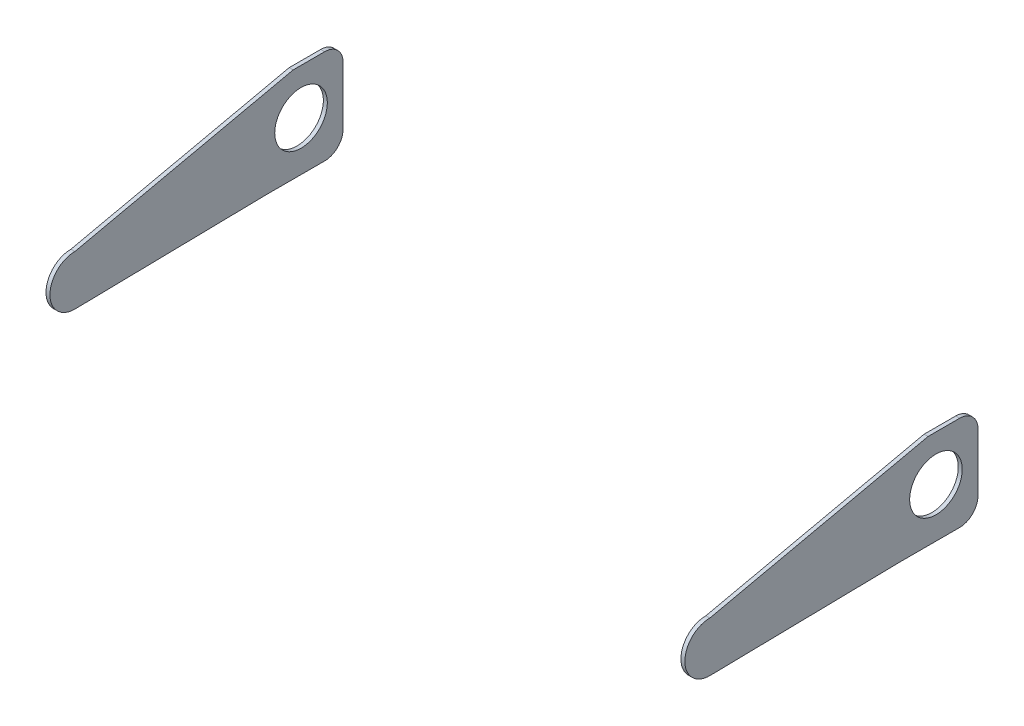
ISO-10303-21;
HEADER;
FILE_DESCRIPTION(('STEP AP214'),'2;1');
FILE_NAME('part.step','',(''),(''),'','','');
FILE_SCHEMA(('AUTOMOTIVE_DESIGN { 1 0 10303 214 1 1 1 1 }'));
ENDSEC;
DATA;
#1=APPLICATION_CONTEXT('core data for automotive mechanical design processes');
#2=APPLICATION_PROTOCOL_DEFINITION('international standard','automotive_design',2000,#1);
#3=PRODUCT_CONTEXT('',#1,'mechanical');
#4=PRODUCT('Part','Part','',(#3));
#5=PRODUCT_RELATED_PRODUCT_CATEGORY('part','',(#4));
#6=PRODUCT_DEFINITION_FORMATION('','',#4);
#7=PRODUCT_DEFINITION_CONTEXT('part definition',#1,'design');
#8=PRODUCT_DEFINITION('design','',#6,#7);
#9=PRODUCT_DEFINITION_SHAPE('','',#8);
#10=(LENGTH_UNIT() NAMED_UNIT(*) SI_UNIT(.MILLI.,.METRE.));
#11=(NAMED_UNIT(*) PLANE_ANGLE_UNIT() SI_UNIT($,.RADIAN.));
#12=(NAMED_UNIT(*) SI_UNIT($,.STERADIAN.) SOLID_ANGLE_UNIT());
#13=UNCERTAINTY_MEASURE_WITH_UNIT(LENGTH_MEASURE(1.E-05),#10,'distance_accuracy_value','');
#14=(GEOMETRIC_REPRESENTATION_CONTEXT(3) GLOBAL_UNCERTAINTY_ASSIGNED_CONTEXT((#13)) GLOBAL_UNIT_ASSIGNED_CONTEXT((#10,
#11,#12)) REPRESENTATION_CONTEXT('',''));
#15=CARTESIAN_POINT('',(0.,0.,0.));
#16=DIRECTION('',(0.,0.,1.));
#17=DIRECTION('',(1.,0.,0.));
#18=AXIS2_PLACEMENT_3D('',#15,#16,#17);
#19=CARTESIAN_POINT('',(121.5,10.3,-84.));
#20=DIRECTION('',(1.,0.,0.));
#21=DIRECTION('',(0.,0.,1.));
#22=AXIS2_PLACEMENT_3D('',#19,#20,#21);
#23=PLANE('',#22);
#24=DIRECTION('',(0.,0.,-1.));
#25=VECTOR('',#24,1.);
#26=CARTESIAN_POINT('',(121.5,17.3,-72.));
#27=LINE('',#26,#25);
#28=CARTESIAN_POINT('',(121.5,17.3,-72.));
#29=VERTEX_POINT('',#28);
#30=CARTESIAN_POINT('',(121.5,17.3,-84.));
#31=VERTEX_POINT('',#30);
#32=EDGE_CURVE('E166',#29,#31,#27,.T.);
#33=ORIENTED_EDGE('',*,*,#32,.F.);
#34=DIRECTION('',(0.,0.215310657716966,-0.976545606038698));
#35=VECTOR('',#34,1.);
#36=CARTESIAN_POINT('',(121.5,17.3,-72.));
#37=LINE('',#36,#35);
#38=CARTESIAN_POINT('',(121.5,-1.,11.));
#39=VERTEX_POINT('',#38);
#40=EDGE_CURVE('E141',#39,#29,#37,.T.);
#41=ORIENTED_EDGE('',*,*,#40,.F.);
#42=CARTESIAN_POINT('',(121.5,-10.5,11.));
#43=DIRECTION('',(-1.,0.,0.));
#44=DIRECTION('',(0.,0.,1.));
#45=AXIS2_PLACEMENT_3D('',#42,#43,#44);
#46=CIRCLE('',#45,9.5);
#47=CARTESIAN_POINT('',(121.5,-20.,11.));
#48=VERTEX_POINT('',#47);
#49=EDGE_CURVE('E123',#48,#39,#46,.T.);
#50=ORIENTED_EDGE('',*,*,#49,.F.);
#51=DIRECTION('',(0.,-0.0178403028537357,0.999840849132544));
#52=VECTOR('',#51,1.);
#53=CARTESIAN_POINT('',(121.5,-20.,11.));
#54=LINE('',#53,#52);
#55=CARTESIAN_POINT('',(121.5,-18.7,-61.8571210101487));
#56=VERTEX_POINT('',#55);
#57=EDGE_CURVE('E134',#56,#48,#54,.T.);
#58=ORIENTED_EDGE('',*,*,#57,.F.);
#59=DIRECTION('',(0.,0.,1.));
#60=VECTOR('',#59,1.);
#61=CARTESIAN_POINT('',(121.5,-18.7,-61.8571210101487));
#62=LINE('',#61,#60);
#63=CARTESIAN_POINT('',(121.5,-18.7,-84.));
#64=VERTEX_POINT('',#63);
#65=EDGE_CURVE('E138',#64,#56,#62,.T.);
#66=ORIENTED_EDGE('',*,*,#65,.F.);
#67=CARTESIAN_POINT('',(121.5,-11.7,-84.));
#68=DIRECTION('',(-1.,0.,0.));
#69=DIRECTION('',(0.,0.,-1.));
#70=AXIS2_PLACEMENT_3D('',#67,#68,#69);
#71=CIRCLE('',#70,7.);
#72=CARTESIAN_POINT('',(121.5,-11.7,-91.));
#73=VERTEX_POINT('',#72);
#74=EDGE_CURVE('E192',#73,#64,#71,.T.);
#75=ORIENTED_EDGE('',*,*,#74,.F.);
#76=DIRECTION('',(0.,-1.,0.));
#77=VECTOR('',#76,1.);
#78=CARTESIAN_POINT('',(121.5,-11.7,-91.));
#79=LINE('',#78,#77);
#80=CARTESIAN_POINT('',(121.5,10.3,-91.));
#81=VERTEX_POINT('',#80);
#82=EDGE_CURVE('E188',#81,#73,#79,.T.);
#83=ORIENTED_EDGE('',*,*,#82,.F.);
#84=CARTESIAN_POINT('',(121.5,10.3,-84.));
#85=DIRECTION('',(-1.,0.,0.));
#86=DIRECTION('',(0.,0.,1.));
#87=AXIS2_PLACEMENT_3D('',#84,#85,#86);
#88=CIRCLE('',#87,7.);
#89=EDGE_CURVE('E180',#31,#81,#88,.T.);
#90=ORIENTED_EDGE('',*,*,#89,.F.);
#91=EDGE_LOOP('',(#33,#41,#50,#58,#66,#75,#83,#90));
#92=FACE_BOUND('',#91,.T.);
#93=CARTESIAN_POINT('',(121.5,0.,-75.));
#94=DIRECTION('',(-1.,0.,0.));
#95=DIRECTION('',(0.,0.,1.));
#96=AXIS2_PLACEMENT_3D('',#93,#94,#95);
#97=CIRCLE('',#96,9.99999999999999);
#98=CARTESIAN_POINT('',(121.5,0.,-65.));
#99=VERTEX_POINT('',#98);
#100=EDGE_CURVE('E155',#99,#99,#97,.T.);
#101=ORIENTED_EDGE('',*,*,#100,.T.);
#102=EDGE_LOOP('',(#101));
#103=FACE_BOUND('',#102,.T.);
#104=ADVANCED_FACE('F51',(#92,#103),#23,.T.);
#105=CARTESIAN_POINT('',(120.,10.3,-84.));
#106=DIRECTION('',(1.,0.,0.));
#107=DIRECTION('',(0.,0.,1.));
#108=AXIS2_PLACEMENT_3D('',#105,#106,#107);
#109=PLANE('',#108);
#110=DIRECTION('',(0.,0.,-1.));
#111=VECTOR('',#110,1.);
#112=CARTESIAN_POINT('',(120.,17.3,-72.));
#113=LINE('',#112,#111);
#114=CARTESIAN_POINT('',(120.,17.3,-72.));
#115=VERTEX_POINT('',#114);
#116=CARTESIAN_POINT('',(120.,17.3,-84.));
#117=VERTEX_POINT('',#116);
#118=EDGE_CURVE('E146',#115,#117,#113,.T.);
#119=ORIENTED_EDGE('',*,*,#118,.T.);
#120=CARTESIAN_POINT('',(120.,10.3,-84.));
#121=DIRECTION('',(-1.,0.,0.));
#122=DIRECTION('',(0.,0.,1.));
#123=AXIS2_PLACEMENT_3D('',#120,#121,#122);
#124=CIRCLE('',#123,7.);
#125=CARTESIAN_POINT('',(120.,10.3,-91.));
#126=VERTEX_POINT('',#125);
#127=EDGE_CURVE('E151',#117,#126,#124,.T.);
#128=ORIENTED_EDGE('',*,*,#127,.T.);
#129=DIRECTION('',(0.,-1.,0.));
#130=VECTOR('',#129,1.);
#131=CARTESIAN_POINT('',(120.,-11.7,-91.));
#132=LINE('',#131,#130);
#133=CARTESIAN_POINT('',(120.,-11.7,-91.));
#134=VERTEX_POINT('',#133);
#135=EDGE_CURVE('E154',#126,#134,#132,.T.);
#136=ORIENTED_EDGE('',*,*,#135,.T.);
#137=CARTESIAN_POINT('',(120.,-11.7,-84.));
#138=DIRECTION('',(-1.,0.,0.));
#139=DIRECTION('',(0.,0.,-1.));
#140=AXIS2_PLACEMENT_3D('',#137,#138,#139);
#141=CIRCLE('',#140,7.);
#142=CARTESIAN_POINT('',(120.,-18.7,-84.));
#143=VERTEX_POINT('',#142);
#144=EDGE_CURVE('E158',#134,#143,#141,.T.);
#145=ORIENTED_EDGE('',*,*,#144,.T.);
#146=DIRECTION('',(0.,0.,1.));
#147=VECTOR('',#146,1.);
#148=CARTESIAN_POINT('',(120.,-18.7,-61.8571210101487));
#149=LINE('',#148,#147);
#150=CARTESIAN_POINT('',(120.,-18.7,-61.8571210101487));
#151=VERTEX_POINT('',#150);
#152=EDGE_CURVE('E161',#143,#151,#149,.T.);
#153=ORIENTED_EDGE('',*,*,#152,.T.);
#154=DIRECTION('',(0.,-0.0178403028537357,0.999840849132544));
#155=VECTOR('',#154,1.);
#156=CARTESIAN_POINT('',(120.,-20.,11.));
#157=LINE('',#156,#155);
#158=CARTESIAN_POINT('',(120.,-20.,11.));
#159=VERTEX_POINT('',#158);
#160=EDGE_CURVE('E163',#151,#159,#157,.T.);
#161=ORIENTED_EDGE('',*,*,#160,.T.);
#162=CARTESIAN_POINT('',(120.,-10.5,11.));
#163=DIRECTION('',(-1.,0.,0.));
#164=DIRECTION('',(0.,0.,1.));
#165=AXIS2_PLACEMENT_3D('',#162,#163,#164);
#166=CIRCLE('',#165,9.5);
#167=CARTESIAN_POINT('',(120.,-1.,11.));
#168=VERTEX_POINT('',#167);
#169=EDGE_CURVE('E130',#159,#168,#166,.T.);
#170=ORIENTED_EDGE('',*,*,#169,.T.);
#171=DIRECTION('',(0.,0.215310657716966,-0.976545606038698));
#172=VECTOR('',#171,1.);
#173=CARTESIAN_POINT('',(120.,17.3,-72.));
#174=LINE('',#173,#172);
#175=EDGE_CURVE('E170',#168,#115,#174,.T.);
#176=ORIENTED_EDGE('',*,*,#175,.T.);
#177=EDGE_LOOP('',(#119,#128,#136,#145,#153,#161,#170,#176));
#178=FACE_BOUND('',#177,.T.);
#179=CARTESIAN_POINT('',(120.,0.,-75.));
#180=DIRECTION('',(-1.,0.,0.));
#181=DIRECTION('',(0.,0.,1.));
#182=AXIS2_PLACEMENT_3D('',#179,#180,#181);
#183=CIRCLE('',#182,9.99999999999999);
#184=CARTESIAN_POINT('',(120.,0.,-65.));
#185=VERTEX_POINT('',#184);
#186=EDGE_CURVE('E194',#185,#185,#183,.T.);
#187=ORIENTED_EDGE('',*,*,#186,.F.);
#188=EDGE_LOOP('',(#187));
#189=FACE_BOUND('',#188,.T.);
#190=ADVANCED_FACE('F183',(#178,#189),#109,.F.);
#191=CARTESIAN_POINT('',(121.5,17.3,-72.));
#192=DIRECTION('',(0.,-1.,0.));
#193=DIRECTION('',(0.,0.,-1.));
#194=AXIS2_PLACEMENT_3D('',#191,#192,#193);
#195=PLANE('',#194);
#196=ORIENTED_EDGE('',*,*,#118,.F.);
#197=DIRECTION('',(-1.,0.,0.));
#198=VECTOR('',#197,1.);
#199=CARTESIAN_POINT('',(121.5,17.3,-72.));
#200=LINE('',#199,#198);
#201=EDGE_CURVE('E70',#29,#115,#200,.T.);
#202=ORIENTED_EDGE('',*,*,#201,.F.);
#203=ORIENTED_EDGE('',*,*,#32,.T.);
#204=DIRECTION('',(-1.,0.,0.));
#205=VECTOR('',#204,1.);
#206=CARTESIAN_POINT('',(121.5,17.3,-84.));
#207=LINE('',#206,#205);
#208=EDGE_CURVE('E12',#31,#117,#207,.T.);
#209=ORIENTED_EDGE('',*,*,#208,.T.);
#210=EDGE_LOOP('',(#196,#202,#203,#209));
#211=FACE_BOUND('',#210,.T.);
#212=ADVANCED_FACE('F52',(#211),#195,.F.);
#213=CARTESIAN_POINT('',(121.5,10.3,-84.));
#214=DIRECTION('',(-1.,0.,0.));
#215=DIRECTION('',(0.,0.,-1.));
#216=AXIS2_PLACEMENT_3D('',#213,#214,#215);
#217=CYLINDRICAL_SURFACE('',#216,7.);
#218=ORIENTED_EDGE('',*,*,#127,.F.);
#219=ORIENTED_EDGE('',*,*,#208,.F.);
#220=ORIENTED_EDGE('',*,*,#89,.T.);
#221=DIRECTION('',(-1.,0.,0.));
#222=VECTOR('',#221,1.);
#223=CARTESIAN_POINT('',(121.5,10.3,-91.));
#224=LINE('',#223,#222);
#225=EDGE_CURVE('E58',#81,#126,#224,.T.);
#226=ORIENTED_EDGE('',*,*,#225,.T.);
#227=EDGE_LOOP('',(#218,#219,#220,#226));
#228=FACE_BOUND('',#227,.T.);
#229=ADVANCED_FACE('F176',(#228),#217,.T.);
#230=CARTESIAN_POINT('',(121.5,-11.7,-91.));
#231=DIRECTION('',(0.,0.,1.));
#232=DIRECTION('',(-1.,0.,0.));
#233=AXIS2_PLACEMENT_3D('',#230,#231,#232);
#234=PLANE('',#233);
#235=ORIENTED_EDGE('',*,*,#135,.F.);
#236=ORIENTED_EDGE('',*,*,#225,.F.);
#237=ORIENTED_EDGE('',*,*,#82,.T.);
#238=DIRECTION('',(-1.,0.,0.));
#239=VECTOR('',#238,1.);
#240=CARTESIAN_POINT('',(121.5,-11.7,-91.));
#241=LINE('',#240,#239);
#242=EDGE_CURVE('E171',#73,#134,#241,.T.);
#243=ORIENTED_EDGE('',*,*,#242,.T.);
#244=EDGE_LOOP('',(#235,#236,#237,#243));
#245=FACE_BOUND('',#244,.T.);
#246=ADVANCED_FACE('F185',(#245),#234,.F.);
#247=CARTESIAN_POINT('',(121.5,-11.7,-84.));
#248=DIRECTION('',(-1.,0.,0.));
#249=DIRECTION('',(0.,0.,-1.));
#250=AXIS2_PLACEMENT_3D('',#247,#248,#249);
#251=CYLINDRICAL_SURFACE('',#250,7.);
#252=ORIENTED_EDGE('',*,*,#144,.F.);
#253=ORIENTED_EDGE('',*,*,#242,.F.);
#254=ORIENTED_EDGE('',*,*,#74,.T.);
#255=DIRECTION('',(-1.,0.,0.));
#256=VECTOR('',#255,1.);
#257=CARTESIAN_POINT('',(121.5,-18.7,-84.));
#258=LINE('',#257,#256);
#259=EDGE_CURVE('E173',#64,#143,#258,.T.);
#260=ORIENTED_EDGE('',*,*,#259,.T.);
#261=EDGE_LOOP('',(#252,#253,#254,#260));
#262=FACE_BOUND('',#261,.T.);
#263=ADVANCED_FACE('F205',(#262),#251,.T.);
#264=CARTESIAN_POINT('',(121.5,-18.7,-61.8571210101487));
#265=DIRECTION('',(0.,1.,0.));
#266=DIRECTION('',(0.,0.,1.));
#267=AXIS2_PLACEMENT_3D('',#264,#265,#266);
#268=PLANE('',#267);
#269=ORIENTED_EDGE('',*,*,#152,.F.);
#270=ORIENTED_EDGE('',*,*,#259,.F.);
#271=ORIENTED_EDGE('',*,*,#65,.T.);
#272=DIRECTION('',(-1.,0.,0.));
#273=VECTOR('',#272,1.);
#274=CARTESIAN_POINT('',(121.5,-18.7,-61.8571210101487));
#275=LINE('',#274,#273);
#276=EDGE_CURVE('E132',#56,#151,#275,.T.);
#277=ORIENTED_EDGE('',*,*,#276,.T.);
#278=EDGE_LOOP('',(#269,#270,#271,#277));
#279=FACE_BOUND('',#278,.T.);
#280=ADVANCED_FACE('F200',(#279),#268,.F.);
#281=CARTESIAN_POINT('',(121.5,-20.,11.));
#282=DIRECTION('',(0.,0.999840849132544,0.0178403028537357));
#283=DIRECTION('',(0.,-0.0178403028537357,0.999840849132544));
#284=AXIS2_PLACEMENT_3D('',#281,#282,#283);
#285=PLANE('',#284);
#286=ORIENTED_EDGE('',*,*,#160,.F.);
#287=ORIENTED_EDGE('',*,*,#276,.F.);
#288=ORIENTED_EDGE('',*,*,#57,.T.);
#289=DIRECTION('',(-1.,0.,0.));
#290=VECTOR('',#289,1.);
#291=CARTESIAN_POINT('',(121.5,-20.,11.));
#292=LINE('',#291,#290);
#293=EDGE_CURVE('E116',#48,#159,#292,.T.);
#294=ORIENTED_EDGE('',*,*,#293,.T.);
#295=EDGE_LOOP('',(#286,#287,#288,#294));
#296=FACE_BOUND('',#295,.T.);
#297=ADVANCED_FACE('F131',(#296),#285,.F.);
#298=CARTESIAN_POINT('',(121.5,-10.5,11.));
#299=DIRECTION('',(-1.,0.,0.));
#300=DIRECTION('',(0.,0.,-1.));
#301=AXIS2_PLACEMENT_3D('',#298,#299,#300);
#302=CYLINDRICAL_SURFACE('',#301,9.5);
#303=ORIENTED_EDGE('',*,*,#169,.F.);
#304=ORIENTED_EDGE('',*,*,#293,.F.);
#305=ORIENTED_EDGE('',*,*,#49,.T.);
#306=DIRECTION('',(-1.,0.,0.));
#307=VECTOR('',#306,1.);
#308=CARTESIAN_POINT('',(121.5,-1.,11.));
#309=LINE('',#308,#307);
#310=EDGE_CURVE('E96',#39,#168,#309,.T.);
#311=ORIENTED_EDGE('',*,*,#310,.T.);
#312=EDGE_LOOP('',(#303,#304,#305,#311));
#313=FACE_BOUND('',#312,.T.);
#314=ADVANCED_FACE('F121',(#313),#302,.T.);
#315=CARTESIAN_POINT('',(121.5,17.3,-72.));
#316=DIRECTION('',(0.,-0.976545606038698,-0.215310657716966));
#317=DIRECTION('',(0.,0.215310657716966,-0.976545606038698));
#318=AXIS2_PLACEMENT_3D('',#315,#316,#317);
#319=PLANE('',#318);
#320=ORIENTED_EDGE('',*,*,#175,.F.);
#321=ORIENTED_EDGE('',*,*,#310,.F.);
#322=ORIENTED_EDGE('',*,*,#40,.T.);
#323=ORIENTED_EDGE('',*,*,#201,.T.);
#324=EDGE_LOOP('',(#320,#321,#322,#323));
#325=FACE_BOUND('',#324,.T.);
#326=ADVANCED_FACE('F219',(#325),#319,.F.);
#327=CARTESIAN_POINT('',(121.5,0.,-75.));
#328=DIRECTION('',(-1.,0.,0.));
#329=DIRECTION('',(0.,0.,-1.));
#330=AXIS2_PLACEMENT_3D('',#327,#328,#329);
#331=CYLINDRICAL_SURFACE('',#330,9.99999999999999);
#332=ORIENTED_EDGE('',*,*,#100,.F.);
#333=EDGE_LOOP('',(#332));
#334=FACE_BOUND('',#333,.T.);
#335=ORIENTED_EDGE('',*,*,#186,.T.);
#336=EDGE_LOOP('',(#335));
#337=FACE_BOUND('',#336,.T.);
#338=ADVANCED_FACE('F217',(#334,#337),#331,.F.);
#339=CLOSED_SHELL('',(#104,#190,#212,#229,#246,#263,#280,#297,#314,#326,#338));
#340=MANIFOLD_SOLID_BREP('B2',#339);
#341=CARTESIAN_POINT('',(-121.5,10.3,-84.));
#342=DIRECTION('',(-1.,0.,0.));
#343=DIRECTION('',(0.,0.,1.));
#344=AXIS2_PLACEMENT_3D('',#341,#342,#343);
#345=PLANE('',#344);
#346=DIRECTION('',(0.,0.,-1.));
#347=VECTOR('',#346,1.);
#348=CARTESIAN_POINT('',(-121.5,17.3,-72.));
#349=LINE('',#348,#347);
#350=CARTESIAN_POINT('',(-121.5,17.3,-72.));
#351=VERTEX_POINT('',#350);
#352=CARTESIAN_POINT('',(-121.5,17.3,-84.));
#353=VERTEX_POINT('',#352);
#354=EDGE_CURVE('E411',#351,#353,#349,.T.);
#355=ORIENTED_EDGE('',*,*,#354,.T.);
#356=CARTESIAN_POINT('',(-121.5,10.3,-84.));
#357=DIRECTION('',(-1.,0.,0.));
#358=DIRECTION('',(0.,0.,1.));
#359=AXIS2_PLACEMENT_3D('',#356,#357,#358);
#360=CIRCLE('',#359,7.);
#361=CARTESIAN_POINT('',(-121.5,10.3,-91.));
#362=VERTEX_POINT('',#361);
#363=EDGE_CURVE('E357',#353,#362,#360,.T.);
#364=ORIENTED_EDGE('',*,*,#363,.T.);
#365=DIRECTION('',(0.,-1.,0.));
#366=VECTOR('',#365,1.);
#367=CARTESIAN_POINT('',(-121.5,-11.7,-91.));
#368=LINE('',#367,#366);
#369=CARTESIAN_POINT('',(-121.5,-11.7,-91.));
#370=VERTEX_POINT('',#369);
#371=EDGE_CURVE('E430',#362,#370,#368,.T.);
#372=ORIENTED_EDGE('',*,*,#371,.T.);
#373=CARTESIAN_POINT('',(-121.5,-11.7,-84.));
#374=DIRECTION('',(-1.,0.,0.));
#375=DIRECTION('',(0.,0.,-1.));
#376=AXIS2_PLACEMENT_3D('',#373,#374,#375);
#377=CIRCLE('',#376,7.);
#378=CARTESIAN_POINT('',(-121.5,-18.7,-84.));
#379=VERTEX_POINT('',#378);
#380=EDGE_CURVE('E439',#370,#379,#377,.T.);
#381=ORIENTED_EDGE('',*,*,#380,.T.);
#382=DIRECTION('',(0.,0.,1.));
#383=VECTOR('',#382,1.);
#384=CARTESIAN_POINT('',(-121.5,-18.7,-61.8571210101487));
#385=LINE('',#384,#383);
#386=CARTESIAN_POINT('',(-121.5,-18.7,-61.8571210101487));
#387=VERTEX_POINT('',#386);
#388=EDGE_CURVE('E377',#379,#387,#385,.T.);
#389=ORIENTED_EDGE('',*,*,#388,.T.);
#390=DIRECTION('',(0.,-0.0178403028537357,0.999840849132544));
#391=VECTOR('',#390,1.);
#392=CARTESIAN_POINT('',(-121.5,-20.,11.));
#393=LINE('',#392,#391);
#394=CARTESIAN_POINT('',(-121.5,-20.,11.));
#395=VERTEX_POINT('',#394);
#396=EDGE_CURVE('E373',#387,#395,#393,.T.);
#397=ORIENTED_EDGE('',*,*,#396,.T.);
#398=CARTESIAN_POINT('',(-121.5,-10.5,11.));
#399=DIRECTION('',(-1.,0.,0.));
#400=DIRECTION('',(0.,0.,1.));
#401=AXIS2_PLACEMENT_3D('',#398,#399,#400);
#402=CIRCLE('',#401,9.5);
#403=CARTESIAN_POINT('',(-121.5,-1.,11.));
#404=VERTEX_POINT('',#403);
#405=EDGE_CURVE('E380',#395,#404,#402,.T.);
#406=ORIENTED_EDGE('',*,*,#405,.T.);
#407=DIRECTION('',(0.,0.215310657716966,-0.976545606038698));
#408=VECTOR('',#407,1.);
#409=CARTESIAN_POINT('',(-121.5,17.3,-72.));
#410=LINE('',#409,#408);
#411=EDGE_CURVE('E320',#404,#351,#410,.T.);
#412=ORIENTED_EDGE('',*,*,#411,.T.);
#413=EDGE_LOOP('',(#355,#364,#372,#381,#389,#397,#406,#412));
#414=FACE_BOUND('',#413,.T.);
#415=CARTESIAN_POINT('',(-121.5,0.,-75.));
#416=DIRECTION('',(-1.,0.,0.));
#417=DIRECTION('',(0.,0.,1.));
#418=AXIS2_PLACEMENT_3D('',#415,#416,#417);
#419=CIRCLE('',#418,9.99999999999999);
#420=CARTESIAN_POINT('',(-121.5,0.,-65.));
#421=VERTEX_POINT('',#420);
#422=EDGE_CURVE('E402',#421,#421,#419,.T.);
#423=ORIENTED_EDGE('',*,*,#422,.F.);
#424=EDGE_LOOP('',(#423));
#425=FACE_BOUND('',#424,.T.);
#426=ADVANCED_FACE('F296',(#414,#425),#345,.T.);
#427=CARTESIAN_POINT('',(-120.,10.3,-84.));
#428=DIRECTION('',(-1.,0.,0.));
#429=DIRECTION('',(0.,0.,1.));
#430=AXIS2_PLACEMENT_3D('',#427,#428,#429);
#431=PLANE('',#430);
#432=DIRECTION('',(0.,0.,-1.));
#433=VECTOR('',#432,1.);
#434=CARTESIAN_POINT('',(-120.,17.3,-72.));
#435=LINE('',#434,#433);
#436=CARTESIAN_POINT('',(-120.,17.3,-72.));
#437=VERTEX_POINT('',#436);
#438=CARTESIAN_POINT('',(-120.,17.3,-84.));
#439=VERTEX_POINT('',#438);
#440=EDGE_CURVE('E396',#437,#439,#435,.T.);
#441=ORIENTED_EDGE('',*,*,#440,.F.);
#442=DIRECTION('',(0.,0.215310657716966,-0.976545606038698));
#443=VECTOR('',#442,1.);
#444=CARTESIAN_POINT('',(-120.,17.3,-72.));
#445=LINE('',#444,#443);
#446=CARTESIAN_POINT('',(-120.,-1.,11.));
#447=VERTEX_POINT('',#446);
#448=EDGE_CURVE('E355',#447,#437,#445,.T.);
#449=ORIENTED_EDGE('',*,*,#448,.F.);
#450=CARTESIAN_POINT('',(-120.,-10.5,11.));
#451=DIRECTION('',(-1.,0.,0.));
#452=DIRECTION('',(0.,0.,1.));
#453=AXIS2_PLACEMENT_3D('',#450,#451,#452);
#454=CIRCLE('',#453,9.5);
#455=CARTESIAN_POINT('',(-120.,-20.,11.));
#456=VERTEX_POINT('',#455);
#457=EDGE_CURVE('E347',#456,#447,#454,.T.);
#458=ORIENTED_EDGE('',*,*,#457,.F.);
#459=DIRECTION('',(0.,-0.0178403028537357,0.999840849132544));
#460=VECTOR('',#459,1.);
#461=CARTESIAN_POINT('',(-120.,-20.,11.));
#462=LINE('',#461,#460);
#463=CARTESIAN_POINT('',(-120.,-18.7,-61.8571210101487));
#464=VERTEX_POINT('',#463);
#465=EDGE_CURVE('E390',#464,#456,#462,.T.);
#466=ORIENTED_EDGE('',*,*,#465,.F.);
#467=DIRECTION('',(0.,0.,1.));
#468=VECTOR('',#467,1.);
#469=CARTESIAN_POINT('',(-120.,-18.7,-61.8571210101487));
#470=LINE('',#469,#468);
#471=CARTESIAN_POINT('',(-120.,-18.7,-84.));
#472=VERTEX_POINT('',#471);
#473=EDGE_CURVE('E410',#472,#464,#470,.T.);
#474=ORIENTED_EDGE('',*,*,#473,.F.);
#475=CARTESIAN_POINT('',(-120.,-11.7,-84.));
#476=DIRECTION('',(-1.,0.,0.));
#477=DIRECTION('',(0.,0.,-1.));
#478=AXIS2_PLACEMENT_3D('',#475,#476,#477);
#479=CIRCLE('',#478,7.);
#480=CARTESIAN_POINT('',(-120.,-11.7,-91.));
#481=VERTEX_POINT('',#480);
#482=EDGE_CURVE('E403',#481,#472,#479,.T.);
#483=ORIENTED_EDGE('',*,*,#482,.F.);
#484=DIRECTION('',(0.,-1.,0.));
#485=VECTOR('',#484,1.);
#486=CARTESIAN_POINT('',(-120.,-11.7,-91.));
#487=LINE('',#486,#485);
#488=CARTESIAN_POINT('',(-120.,10.3,-91.));
#489=VERTEX_POINT('',#488);
#490=EDGE_CURVE('E401',#489,#481,#487,.T.);
#491=ORIENTED_EDGE('',*,*,#490,.F.);
#492=CARTESIAN_POINT('',(-120.,10.3,-84.));
#493=DIRECTION('',(-1.,0.,0.));
#494=DIRECTION('',(0.,0.,1.));
#495=AXIS2_PLACEMENT_3D('',#492,#493,#494);
#496=CIRCLE('',#495,7.);
#497=EDGE_CURVE('E397',#439,#489,#496,.T.);
#498=ORIENTED_EDGE('',*,*,#497,.F.);
#499=EDGE_LOOP('',(#441,#449,#458,#466,#474,#483,#491,#498));
#500=FACE_BOUND('',#499,.T.);
#501=CARTESIAN_POINT('',(-120.,0.,-75.));
#502=DIRECTION('',(-1.,0.,0.));
#503=DIRECTION('',(0.,0.,1.));
#504=AXIS2_PLACEMENT_3D('',#501,#502,#503);
#505=CIRCLE('',#504,9.99999999999999);
#506=CARTESIAN_POINT('',(-120.,0.,-65.));
#507=VERTEX_POINT('',#506);
#508=EDGE_CURVE('E447',#507,#507,#505,.T.);
#509=ORIENTED_EDGE('',*,*,#508,.T.);
#510=EDGE_LOOP('',(#509));
#511=FACE_BOUND('',#510,.T.);
#512=ADVANCED_FACE('F431',(#500,#511),#431,.F.);
#513=CARTESIAN_POINT('',(-121.5,17.3,-72.));
#514=DIRECTION('',(0.,-1.,0.));
#515=DIRECTION('',(0.,0.,-1.));
#516=AXIS2_PLACEMENT_3D('',#513,#514,#515);
#517=PLANE('',#516);
#518=ORIENTED_EDGE('',*,*,#440,.T.);
#519=DIRECTION('',(1.,0.,0.));
#520=VECTOR('',#519,1.);
#521=CARTESIAN_POINT('',(-121.5,17.3,-84.));
#522=LINE('',#521,#520);
#523=EDGE_CURVE('E47',#353,#439,#522,.T.);
#524=ORIENTED_EDGE('',*,*,#523,.F.);
#525=ORIENTED_EDGE('',*,*,#354,.F.);
#526=DIRECTION('',(1.,0.,0.));
#527=VECTOR('',#526,1.);
#528=CARTESIAN_POINT('',(-121.5,17.3,-72.));
#529=LINE('',#528,#527);
#530=EDGE_CURVE('E393',#351,#437,#529,.T.);
#531=ORIENTED_EDGE('',*,*,#530,.T.);
#532=EDGE_LOOP('',(#518,#524,#525,#531));
#533=FACE_BOUND('',#532,.T.);
#534=ADVANCED_FACE('F301',(#533),#517,.F.);
#535=CARTESIAN_POINT('',(-121.5,10.3,-84.));
#536=DIRECTION('',(1.,0.,0.));
#537=DIRECTION('',(0.,0.,-1.));
#538=AXIS2_PLACEMENT_3D('',#535,#536,#537);
#539=CYLINDRICAL_SURFACE('',#538,7.);
#540=ORIENTED_EDGE('',*,*,#497,.T.);
#541=DIRECTION('',(1.,0.,0.));
#542=VECTOR('',#541,1.);
#543=CARTESIAN_POINT('',(-121.5,10.3,-91.));
#544=LINE('',#543,#542);
#545=EDGE_CURVE('E310',#362,#489,#544,.T.);
#546=ORIENTED_EDGE('',*,*,#545,.F.);
#547=ORIENTED_EDGE('',*,*,#363,.F.);
#548=ORIENTED_EDGE('',*,*,#523,.T.);
#549=EDGE_LOOP('',(#540,#546,#547,#548));
#550=FACE_BOUND('',#549,.T.);
#551=ADVANCED_FACE('F475',(#550),#539,.T.);
#552=CARTESIAN_POINT('',(-121.5,-11.7,-91.));
#553=DIRECTION('',(0.,0.,1.));
#554=DIRECTION('',(1.,0.,0.));
#555=AXIS2_PLACEMENT_3D('',#552,#553,#554);
#556=PLANE('',#555);
#557=ORIENTED_EDGE('',*,*,#490,.T.);
#558=DIRECTION('',(1.,0.,0.));
#559=VECTOR('',#558,1.);
#560=CARTESIAN_POINT('',(-121.5,-11.7,-91.));
#561=LINE('',#560,#559);
#562=EDGE_CURVE('E420',#370,#481,#561,.T.);
#563=ORIENTED_EDGE('',*,*,#562,.F.);
#564=ORIENTED_EDGE('',*,*,#371,.F.);
#565=ORIENTED_EDGE('',*,*,#545,.T.);
#566=EDGE_LOOP('',(#557,#563,#564,#565));
#567=FACE_BOUND('',#566,.T.);
#568=ADVANCED_FACE('F422',(#567),#556,.F.);
#569=CARTESIAN_POINT('',(-121.5,-11.7,-84.));
#570=DIRECTION('',(1.,0.,0.));
#571=DIRECTION('',(0.,0.,-1.));
#572=AXIS2_PLACEMENT_3D('',#569,#570,#571);
#573=CYLINDRICAL_SURFACE('',#572,7.);
#574=ORIENTED_EDGE('',*,*,#482,.T.);
#575=DIRECTION('',(1.,0.,0.));
#576=VECTOR('',#575,1.);
#577=CARTESIAN_POINT('',(-121.5,-18.7,-84.));
#578=LINE('',#577,#576);
#579=EDGE_CURVE('E418',#379,#472,#578,.T.);
#580=ORIENTED_EDGE('',*,*,#579,.F.);
#581=ORIENTED_EDGE('',*,*,#380,.F.);
#582=ORIENTED_EDGE('',*,*,#562,.T.);
#583=EDGE_LOOP('',(#574,#580,#581,#582));
#584=FACE_BOUND('',#583,.T.);
#585=ADVANCED_FACE('F436',(#584),#573,.T.);
#586=CARTESIAN_POINT('',(-121.5,-18.7,-61.8571210101487));
#587=DIRECTION('',(0.,1.,0.));
#588=DIRECTION('',(0.,0.,1.));
#589=AXIS2_PLACEMENT_3D('',#586,#587,#588);
#590=PLANE('',#589);
#591=ORIENTED_EDGE('',*,*,#473,.T.);
#592=DIRECTION('',(1.,0.,0.));
#593=VECTOR('',#592,1.);
#594=CARTESIAN_POINT('',(-121.5,-18.7,-61.8571210101487));
#595=LINE('',#594,#593);
#596=EDGE_CURVE('E389',#387,#464,#595,.T.);
#597=ORIENTED_EDGE('',*,*,#596,.F.);
#598=ORIENTED_EDGE('',*,*,#388,.F.);
#599=ORIENTED_EDGE('',*,*,#579,.T.);
#600=EDGE_LOOP('',(#591,#597,#598,#599));
#601=FACE_BOUND('',#600,.T.);
#602=ADVANCED_FACE('F438',(#601),#590,.F.);
#603=CARTESIAN_POINT('',(-121.5,-20.,11.));
#604=DIRECTION('',(0.,0.999840849132544,0.0178403028537357));
#605=DIRECTION('',(0.,-0.0178403028537357,0.999840849132544));
#606=AXIS2_PLACEMENT_3D('',#603,#604,#605);
#607=PLANE('',#606);
#608=ORIENTED_EDGE('',*,*,#465,.T.);
#609=DIRECTION('',(1.,0.,0.));
#610=VECTOR('',#609,1.);
#611=CARTESIAN_POINT('',(-121.5,-20.,11.));
#612=LINE('',#611,#610);
#613=EDGE_CURVE('E383',#395,#456,#612,.T.);
#614=ORIENTED_EDGE('',*,*,#613,.F.);
#615=ORIENTED_EDGE('',*,*,#396,.F.);
#616=ORIENTED_EDGE('',*,*,#596,.T.);
#617=EDGE_LOOP('',(#608,#614,#615,#616));
#618=FACE_BOUND('',#617,.T.);
#619=ADVANCED_FACE('F384',(#618),#607,.F.);
#620=CARTESIAN_POINT('',(-121.5,-10.5,11.));
#621=DIRECTION('',(1.,0.,0.));
#622=DIRECTION('',(0.,0.,-1.));
#623=AXIS2_PLACEMENT_3D('',#620,#621,#622);
#624=CYLINDRICAL_SURFACE('',#623,9.5);
#625=ORIENTED_EDGE('',*,*,#457,.T.);
#626=DIRECTION('',(1.,0.,0.));
#627=VECTOR('',#626,1.);
#628=CARTESIAN_POINT('',(-121.5,-1.,11.));
#629=LINE('',#628,#627);
#630=EDGE_CURVE('E386',#404,#447,#629,.T.);
#631=ORIENTED_EDGE('',*,*,#630,.F.);
#632=ORIENTED_EDGE('',*,*,#405,.F.);
#633=ORIENTED_EDGE('',*,*,#613,.T.);
#634=EDGE_LOOP('',(#625,#631,#632,#633));
#635=FACE_BOUND('',#634,.T.);
#636=ADVANCED_FACE('F392',(#635),#624,.T.);
#637=CARTESIAN_POINT('',(-121.5,17.3,-72.));
#638=DIRECTION('',(0.,-0.976545606038698,-0.215310657716966));
#639=DIRECTION('',(0.,0.215310657716966,-0.976545606038698));
#640=AXIS2_PLACEMENT_3D('',#637,#638,#639);
#641=PLANE('',#640);
#642=ORIENTED_EDGE('',*,*,#448,.T.);
#643=ORIENTED_EDGE('',*,*,#530,.F.);
#644=ORIENTED_EDGE('',*,*,#411,.F.);
#645=ORIENTED_EDGE('',*,*,#630,.T.);
#646=EDGE_LOOP('',(#642,#643,#644,#645));
#647=FACE_BOUND('',#646,.T.);
#648=ADVANCED_FACE('F465',(#647),#641,.F.);
#649=CARTESIAN_POINT('',(-121.5,0.,-75.));
#650=DIRECTION('',(1.,0.,0.));
#651=DIRECTION('',(0.,0.,-1.));
#652=AXIS2_PLACEMENT_3D('',#649,#650,#651);
#653=CYLINDRICAL_SURFACE('',#652,9.99999999999999);
#654=ORIENTED_EDGE('',*,*,#422,.T.);
#655=EDGE_LOOP('',(#654));
#656=FACE_BOUND('',#655,.T.);
#657=ORIENTED_EDGE('',*,*,#508,.F.);
#658=EDGE_LOOP('',(#657));
#659=FACE_BOUND('',#658,.T.);
#660=ADVANCED_FACE('F451',(#656,#659),#653,.F.);
#661=CLOSED_SHELL('',(#426,#512,#534,#551,#568,#585,#602,#619,#636,#648,#660));
#662=MANIFOLD_SOLID_BREP('B6',#661);
#663=ADVANCED_BREP_SHAPE_REPRESENTATION('',(#18,#340,#662),#14);
#664=SHAPE_DEFINITION_REPRESENTATION(#9,#663);
ENDSEC;
END-ISO-10303-21;
